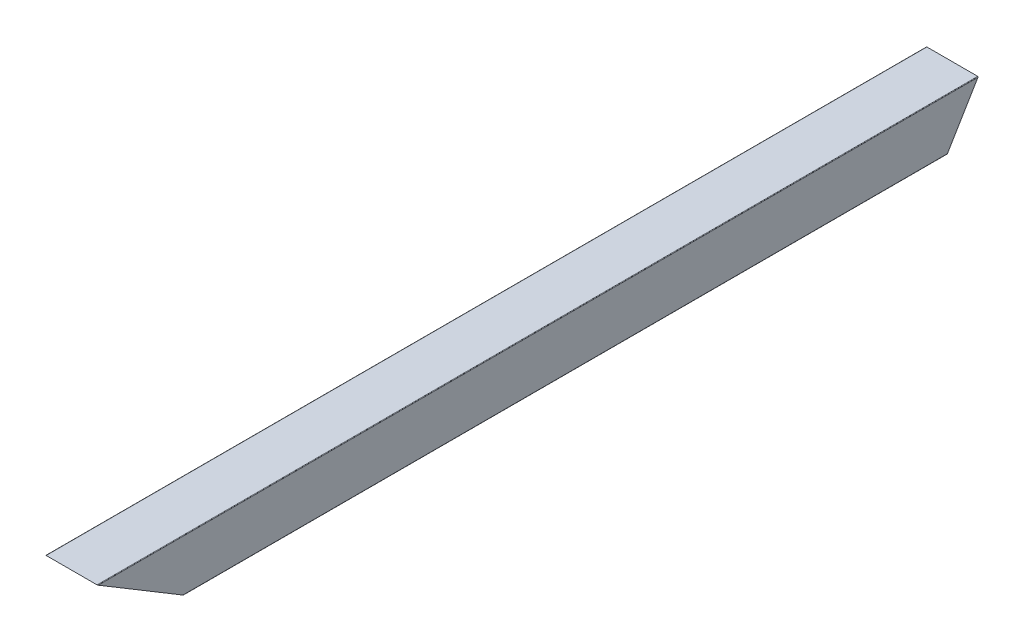
ISO-10303-21;
HEADER;
FILE_DESCRIPTION(('STEP AP214'),'2;1');
FILE_NAME('part.step','',(''),(''),'','','');
FILE_SCHEMA(('AUTOMOTIVE_DESIGN { 1 0 10303 214 1 1 1 1 }'));
ENDSEC;
DATA;
#1=APPLICATION_CONTEXT('core data for automotive mechanical design processes');
#2=APPLICATION_PROTOCOL_DEFINITION('international standard','automotive_design',2000,#1);
#3=PRODUCT_CONTEXT('',#1,'mechanical');
#4=PRODUCT('Part','Part','',(#3));
#5=PRODUCT_RELATED_PRODUCT_CATEGORY('part','',(#4));
#6=PRODUCT_DEFINITION_FORMATION('','',#4);
#7=PRODUCT_DEFINITION_CONTEXT('part definition',#1,'design');
#8=PRODUCT_DEFINITION('design','',#6,#7);
#9=PRODUCT_DEFINITION_SHAPE('','',#8);
#10=(LENGTH_UNIT() NAMED_UNIT(*) SI_UNIT(.MILLI.,.METRE.));
#11=(NAMED_UNIT(*) PLANE_ANGLE_UNIT() SI_UNIT($,.RADIAN.));
#12=(NAMED_UNIT(*) SI_UNIT($,.STERADIAN.) SOLID_ANGLE_UNIT());
#13=UNCERTAINTY_MEASURE_WITH_UNIT(LENGTH_MEASURE(1.E-05),#10,'distance_accuracy_value','');
#14=(GEOMETRIC_REPRESENTATION_CONTEXT(3) GLOBAL_UNCERTAINTY_ASSIGNED_CONTEXT((#13)) GLOBAL_UNIT_ASSIGNED_CONTEXT((#10,
#11,#12)) REPRESENTATION_CONTEXT('',''));
#15=CARTESIAN_POINT('',(0.,0.,0.));
#16=DIRECTION('',(0.,0.,1.));
#17=DIRECTION('',(1.,0.,0.));
#18=AXIS2_PLACEMENT_3D('',#15,#16,#17);
#19=CARTESIAN_POINT('',(0.254,25.4,1828.8));
#20=DIRECTION('',(0.,-1.,0.));
#21=DIRECTION('',(0.,0.,-1.));
#22=AXIS2_PLACEMENT_3D('',#19,#20,#21);
#23=PLANE('',#22);
#24=DIRECTION('',(0.,0.,-1.));
#25=VECTOR('',#24,1.);
#26=CARTESIAN_POINT('',(0.254,25.4,1828.8));
#27=LINE('',#26,#25);
#28=CARTESIAN_POINT('',(0.253999999999976,25.4,431.487140160496));
#29=VERTEX_POINT('',#28);
#30=CARTESIAN_POINT('',(0.254,25.4,0.));
#31=VERTEX_POINT('',#30);
#32=EDGE_CURVE('E195',#29,#31,#27,.T.);
#33=ORIENTED_EDGE('',*,*,#32,.F.);
#34=DIRECTION('',(1.,0.,0.));
#35=VECTOR('',#34,1.);
#36=CARTESIAN_POINT('',(-1155.7,25.4,431.487140160496));
#37=LINE('',#36,#35);
#38=CARTESIAN_POINT('',(25.146,25.4,431.487140160496));
#39=VERTEX_POINT('',#38);
#40=EDGE_CURVE('E167',#29,#39,#37,.T.);
#41=ORIENTED_EDGE('',*,*,#40,.T.);
#42=DIRECTION('',(0.,0.,-1.));
#43=VECTOR('',#42,1.);
#44=CARTESIAN_POINT('',(25.146,25.4,1828.8));
#45=LINE('',#44,#43);
#46=CARTESIAN_POINT('',(25.146,25.4,0.));
#47=VERTEX_POINT('',#46);
#48=EDGE_CURVE('E184',#39,#47,#45,.T.);
#49=ORIENTED_EDGE('',*,*,#48,.T.);
#50=DIRECTION('',(-1.,0.,0.));
#51=VECTOR('',#50,1.);
#52=CARTESIAN_POINT('',(0.254,25.4,0.));
#53=LINE('',#52,#51);
#54=EDGE_CURVE('E216',#47,#31,#53,.T.);
#55=ORIENTED_EDGE('',*,*,#54,.T.);
#56=EDGE_LOOP('',(#33,#41,#49,#55));
#57=FACE_BOUND('',#56,.T.);
#58=ADVANCED_FACE('F42',(#57),#23,.F.);
#59=CARTESIAN_POINT('',(0.254,0.254,1828.8));
#60=DIRECTION('',(0.,0.,-1.));
#61=DIRECTION('',(-1.,0.,0.));
#62=AXIS2_PLACEMENT_3D('',#59,#60,#61);
#63=CYLINDRICAL_SURFACE('',#62,0.254);
#64=CARTESIAN_POINT('',(0.254,0.254,389.63716829731));
#65=DIRECTION('',(0.,0.857167300702112,-0.515038074910055));
#66=DIRECTION('',(0.,-0.515038074910055,-0.857167300702112));
#67=AXIS2_PLACEMENT_3D('',#64,#65,#66);
#68=ELLIPSE('',#67,0.493167422708229,0.254);
#69=CARTESIAN_POINT('',(0.,0.253999999999865,389.63716829731));
#70=VERTEX_POINT('',#69);
#71=CARTESIAN_POINT('',(0.253999999999976,0.,389.214441308793));
#72=VERTEX_POINT('',#71);
#73=EDGE_CURVE('E302',#70,#72,#68,.F.);
#74=ORIENTED_EDGE('',*,*,#73,.F.);
#75=DIRECTION('',(0.,0.,-1.));
#76=VECTOR('',#75,1.);
#77=CARTESIAN_POINT('',(0.,0.254,1828.8));
#78=LINE('',#77,#76);
#79=CARTESIAN_POINT('',(0.,0.254000000000026,15.0876));
#80=VERTEX_POINT('',#79);
#81=EDGE_CURVE('E186',#70,#80,#78,.T.);
#82=ORIENTED_EDGE('',*,*,#81,.T.);
#83=CARTESIAN_POINT('',(0.254,0.254,15.0876));
#84=DIRECTION('',(0.,0.514495755427526,0.857492925712544));
#85=DIRECTION('',(0.,0.857492925712544,-0.514495755427526));
#86=AXIS2_PLACEMENT_3D('',#83,#84,#85);
#87=ELLIPSE('',#86,0.296212356258141,0.254);
#88=CARTESIAN_POINT('',(0.254,0.,15.24));
#89=VERTEX_POINT('',#88);
#90=EDGE_CURVE('E289',#89,#80,#87,.F.);
#91=ORIENTED_EDGE('',*,*,#90,.F.);
#92=DIRECTION('',(0.,0.,-1.));
#93=VECTOR('',#92,1.);
#94=CARTESIAN_POINT('',(0.254,0.,1828.8));
#95=LINE('',#94,#93);
#96=EDGE_CURVE('E214',#72,#89,#95,.T.);
#97=ORIENTED_EDGE('',*,*,#96,.F.);
#98=EDGE_LOOP('',(#74,#82,#91,#97));
#99=FACE_BOUND('',#98,.T.);
#100=ADVANCED_FACE('F332',(#99),#63,.T.);
#101=CARTESIAN_POINT('',(0.254,0.,1828.8));
#102=DIRECTION('',(0.,1.,0.));
#103=DIRECTION('',(1.,0.,0.));
#104=AXIS2_PLACEMENT_3D('',#101,#102,#103);
#105=PLANE('',#104);
#106=DIRECTION('',(0.,0.,-1.));
#107=VECTOR('',#106,1.);
#108=CARTESIAN_POINT('',(25.146,0.,1828.8));
#109=LINE('',#108,#107);
#110=CARTESIAN_POINT('',(25.1459999999999,0.,389.214441308793));
#111=VERTEX_POINT('',#110);
#112=CARTESIAN_POINT('',(25.146,0.,15.24));
#113=VERTEX_POINT('',#112);
#114=EDGE_CURVE('E182',#111,#113,#109,.T.);
#115=ORIENTED_EDGE('',*,*,#114,.F.);
#116=DIRECTION('',(1.,0.,0.));
#117=VECTOR('',#116,1.);
#118=CARTESIAN_POINT('',(-1155.7,0.,389.214441308793));
#119=LINE('',#118,#117);
#120=EDGE_CURVE('E163',#72,#111,#119,.T.);
#121=ORIENTED_EDGE('',*,*,#120,.F.);
#122=ORIENTED_EDGE('',*,*,#96,.T.);
#123=DIRECTION('',(1.,0.,0.));
#124=VECTOR('',#123,1.);
#125=CARTESIAN_POINT('',(0.,0.,15.24));
#126=LINE('',#125,#124);
#127=EDGE_CURVE('E292',#89,#113,#126,.T.);
#128=ORIENTED_EDGE('',*,*,#127,.T.);
#129=EDGE_LOOP('',(#115,#121,#122,#128));
#130=FACE_BOUND('',#129,.T.);
#131=ADVANCED_FACE('F337',(#130),#105,.F.);
#132=CARTESIAN_POINT('',(25.146,0.254,1828.8));
#133=DIRECTION('',(0.,0.,-1.));
#134=DIRECTION('',(-1.,0.,0.));
#135=AXIS2_PLACEMENT_3D('',#132,#133,#134);
#136=CYLINDRICAL_SURFACE('',#135,0.254);
#137=CARTESIAN_POINT('',(25.146,0.254,389.63716829731));
#138=DIRECTION('',(0.,0.857167300702112,-0.515038074910055));
#139=DIRECTION('',(0.,-0.515038074910055,-0.857167300702112));
#140=AXIS2_PLACEMENT_3D('',#137,#138,#139);
#141=ELLIPSE('',#140,0.493167422708229,0.254);
#142=CARTESIAN_POINT('',(25.4,0.253999999999796,389.63716829731));
#143=VERTEX_POINT('',#142);
#144=EDGE_CURVE('E157',#111,#143,#141,.F.);
#145=ORIENTED_EDGE('',*,*,#144,.F.);
#146=ORIENTED_EDGE('',*,*,#114,.T.);
#147=CARTESIAN_POINT('',(25.146,0.254,15.0876));
#148=DIRECTION('',(0.,0.514495755427526,0.857492925712544));
#149=DIRECTION('',(0.,0.857492925712544,-0.514495755427526));
#150=AXIS2_PLACEMENT_3D('',#147,#148,#149);
#151=ELLIPSE('',#150,0.296212356258141,0.254);
#152=CARTESIAN_POINT('',(25.4,0.254000000000026,15.0876));
#153=VERTEX_POINT('',#152);
#154=EDGE_CURVE('E181',#153,#113,#151,.F.);
#155=ORIENTED_EDGE('',*,*,#154,.F.);
#156=DIRECTION('',(0.,0.,-1.));
#157=VECTOR('',#156,1.);
#158=CARTESIAN_POINT('',(25.4,0.254,1828.8));
#159=LINE('',#158,#157);
#160=EDGE_CURVE('E174',#143,#153,#159,.T.);
#161=ORIENTED_EDGE('',*,*,#160,.F.);
#162=EDGE_LOOP('',(#145,#146,#155,#161));
#163=FACE_BOUND('',#162,.T.);
#164=ADVANCED_FACE('F179',(#163),#136,.T.);
#165=CARTESIAN_POINT('',(25.4,0.254,1828.8));
#166=DIRECTION('',(-1.,0.,0.));
#167=DIRECTION('',(0.,0.,1.));
#168=AXIS2_PLACEMENT_3D('',#165,#166,#167);
#169=PLANE('',#168);
#170=DIRECTION('',(0.,0.,-1.));
#171=VECTOR('',#170,1.);
#172=CARTESIAN_POINT('',(25.4,25.146,1828.8));
#173=LINE('',#172,#171);
#174=CARTESIAN_POINT('',(25.4,25.1459999999999,431.064413171979));
#175=VERTEX_POINT('',#174);
#176=CARTESIAN_POINT('',(25.4,25.1459999999999,0.152400000000086));
#177=VERTEX_POINT('',#176);
#178=EDGE_CURVE('E176',#175,#177,#173,.T.);
#179=ORIENTED_EDGE('',*,*,#178,.F.);
#180=DIRECTION('',(0.,0.515038074910055,0.857167300702112));
#181=VECTOR('',#180,1.);
#182=CARTESIAN_POINT('',(25.4,25.4,431.487140160496));
#183=LINE('',#182,#181);
#184=EDGE_CURVE('E160',#143,#175,#183,.T.);
#185=ORIENTED_EDGE('',*,*,#184,.F.);
#186=ORIENTED_EDGE('',*,*,#160,.T.);
#187=DIRECTION('',(0.,-0.857492925712544,0.514495755427526));
#188=VECTOR('',#187,1.);
#189=CARTESIAN_POINT('',(25.4,25.4,0.));
#190=LINE('',#189,#188);
#191=EDGE_CURVE('E296',#177,#153,#190,.T.);
#192=ORIENTED_EDGE('',*,*,#191,.F.);
#193=EDGE_LOOP('',(#179,#185,#186,#192));
#194=FACE_BOUND('',#193,.T.);
#195=ADVANCED_FACE('F172',(#194),#169,.F.);
#196=CARTESIAN_POINT('',(25.146,25.146,1828.8));
#197=DIRECTION('',(0.,0.,-1.));
#198=DIRECTION('',(-1.,0.,0.));
#199=AXIS2_PLACEMENT_3D('',#196,#197,#198);
#200=CYLINDRICAL_SURFACE('',#199,0.254);
#201=CARTESIAN_POINT('',(25.146,25.146,431.064413171979));
#202=DIRECTION('',(0.,0.857167300702112,-0.515038074910055));
#203=DIRECTION('',(0.,-0.515038074910055,-0.857167300702112));
#204=AXIS2_PLACEMENT_3D('',#201,#202,#203);
#205=ELLIPSE('',#204,0.493167422708229,0.254);
#206=EDGE_CURVE('E168',#175,#39,#205,.F.);
#207=ORIENTED_EDGE('',*,*,#206,.F.);
#208=ORIENTED_EDGE('',*,*,#178,.T.);
#209=CARTESIAN_POINT('',(25.146,25.146,0.152399999999941));
#210=DIRECTION('',(0.,0.514495755427526,0.857492925712544));
#211=DIRECTION('',(0.,0.857492925712544,-0.514495755427526));
#212=AXIS2_PLACEMENT_3D('',#209,#210,#211);
#213=ELLIPSE('',#212,0.296212356258141,0.254);
#214=EDGE_CURVE('E283',#47,#177,#213,.F.);
#215=ORIENTED_EDGE('',*,*,#214,.F.);
#216=ORIENTED_EDGE('',*,*,#48,.F.);
#217=EDGE_LOOP('',(#207,#208,#215,#216));
#218=FACE_BOUND('',#217,.T.);
#219=ADVANCED_FACE('F345',(#218),#200,.T.);
#220=CARTESIAN_POINT('',(0.254,25.146,1828.8));
#221=DIRECTION('',(0.,0.,-1.));
#222=DIRECTION('',(-1.,0.,0.));
#223=AXIS2_PLACEMENT_3D('',#220,#221,#222);
#224=CYLINDRICAL_SURFACE('',#223,0.254);
#225=CARTESIAN_POINT('',(0.254,25.146,431.064413171979));
#226=DIRECTION('',(0.,0.857167300702112,-0.515038074910055));
#227=DIRECTION('',(0.,-0.515038074910055,-0.857167300702112));
#228=AXIS2_PLACEMENT_3D('',#225,#226,#227);
#229=ELLIPSE('',#228,0.493167422708229,0.254);
#230=CARTESIAN_POINT('',(0.,25.1460000000001,431.064413171979));
#231=VERTEX_POINT('',#230);
#232=EDGE_CURVE('E304',#29,#231,#229,.F.);
#233=ORIENTED_EDGE('',*,*,#232,.F.);
#234=ORIENTED_EDGE('',*,*,#32,.T.);
#235=CARTESIAN_POINT('',(0.254,25.146,0.152399999999941));
#236=DIRECTION('',(0.,0.514495755427526,0.857492925712544));
#237=DIRECTION('',(0.,0.857492925712544,-0.514495755427526));
#238=AXIS2_PLACEMENT_3D('',#235,#236,#237);
#239=ELLIPSE('',#238,0.296212356258141,0.254);
#240=CARTESIAN_POINT('',(0.,25.146,0.152399999999985));
#241=VERTEX_POINT('',#240);
#242=EDGE_CURVE('E281',#241,#31,#239,.F.);
#243=ORIENTED_EDGE('',*,*,#242,.F.);
#244=DIRECTION('',(0.,0.,-1.));
#245=VECTOR('',#244,1.);
#246=CARTESIAN_POINT('',(0.,25.146,1828.8));
#247=LINE('',#246,#245);
#248=EDGE_CURVE('E194',#231,#241,#247,.T.);
#249=ORIENTED_EDGE('',*,*,#248,.F.);
#250=EDGE_LOOP('',(#233,#234,#243,#249));
#251=FACE_BOUND('',#250,.T.);
#252=ADVANCED_FACE('F341',(#251),#224,.T.);
#253=CARTESIAN_POINT('',(0.,0.254,1828.8));
#254=DIRECTION('',(1.,0.,0.));
#255=DIRECTION('',(0.,1.,0.));
#256=AXIS2_PLACEMENT_3D('',#253,#254,#255);
#257=PLANE('',#256);
#258=ORIENTED_EDGE('',*,*,#81,.F.);
#259=DIRECTION('',(0.,0.515038074910055,0.857167300702112));
#260=VECTOR('',#259,1.);
#261=CARTESIAN_POINT('',(0.,635.606678991964,1447.04159600007));
#262=LINE('',#261,#260);
#263=EDGE_CURVE('E274',#70,#231,#262,.T.);
#264=ORIENTED_EDGE('',*,*,#263,.T.);
#265=ORIENTED_EDGE('',*,*,#248,.T.);
#266=DIRECTION('',(0.,-0.857492925712544,0.514495755427526));
#267=VECTOR('',#266,1.);
#268=CARTESIAN_POINT('',(0.,25.4,0.));
#269=LINE('',#268,#267);
#270=EDGE_CURVE('E295',#241,#80,#269,.T.);
#271=ORIENTED_EDGE('',*,*,#270,.T.);
#272=EDGE_LOOP('',(#258,#264,#265,#271));
#273=FACE_BOUND('',#272,.T.);
#274=ADVANCED_FACE('F344',(#273),#257,.F.);
#275=CARTESIAN_POINT('',(0.,25.4,0.));
#276=DIRECTION('',(0.,0.514495755427526,0.857492925712544));
#277=DIRECTION('',(0.,-0.857492925712544,0.514495755427526));
#278=AXIS2_PLACEMENT_3D('',#275,#276,#277);
#279=PLANE('',#278);
#280=DIRECTION('',(0.,-0.857492925712544,0.514495755427526));
#281=VECTOR('',#280,1.);
#282=CARTESIAN_POINT('',(1.5875,-797.76544117647,493.899264705882));
#283=LINE('',#282,#281);
#284=CARTESIAN_POINT('',(1.5875,22.225,1.90500000000005));
#285=VERTEX_POINT('',#284);
#286=CARTESIAN_POINT('',(1.5875,3.175,13.3350000000001));
#287=VERTEX_POINT('',#286);
#288=EDGE_CURVE('E219',#285,#287,#283,.T.);
#289=ORIENTED_EDGE('',*,*,#288,.T.);
#290=CARTESIAN_POINT('',(3.175,3.175,13.3350000000001));
#291=DIRECTION('',(0.,0.514495755427526,0.857492925712544));
#292=DIRECTION('',(0.,0.857492925712544,-0.514495755427526));
#293=AXIS2_PLACEMENT_3D('',#290,#291,#292);
#294=ELLIPSE('',#293,1.85132722661338,1.5875);
#295=CARTESIAN_POINT('',(3.175,1.5875,14.2875000000002));
#296=VERTEX_POINT('',#295);
#297=EDGE_CURVE('E280',#296,#287,#294,.F.);
#298=ORIENTED_EDGE('',*,*,#297,.F.);
#299=DIRECTION('',(1.,0.,0.));
#300=VECTOR('',#299,1.);
#301=CARTESIAN_POINT('',(3.175,1.5875,14.2875000000002));
#302=LINE('',#301,#300);
#303=CARTESIAN_POINT('',(22.225,1.5875,14.2875000000002));
#304=VERTEX_POINT('',#303);
#305=EDGE_CURVE('E254',#296,#304,#302,.T.);
#306=ORIENTED_EDGE('',*,*,#305,.T.);
#307=CARTESIAN_POINT('',(22.225,3.175,13.3350000000001));
#308=DIRECTION('',(0.,0.514495755427526,0.857492925712544));
#309=DIRECTION('',(0.,0.857492925712544,-0.514495755427526));
#310=AXIS2_PLACEMENT_3D('',#307,#308,#309);
#311=ELLIPSE('',#310,1.85132722661338,1.5875);
#312=CARTESIAN_POINT('',(23.8125,3.175,13.3350000000001));
#313=VERTEX_POINT('',#312);
#314=EDGE_CURVE('E241',#313,#304,#311,.F.);
#315=ORIENTED_EDGE('',*,*,#314,.F.);
#316=DIRECTION('',(0.,0.857492925712544,-0.514495755427526));
#317=VECTOR('',#316,1.);
#318=CARTESIAN_POINT('',(23.8125,-797.76544117647,493.899264705882));
#319=LINE('',#318,#317);
#320=CARTESIAN_POINT('',(23.8125,22.2249999999999,1.90500000000055));
#321=VERTEX_POINT('',#320);
#322=EDGE_CURVE('E251',#313,#321,#319,.T.);
#323=ORIENTED_EDGE('',*,*,#322,.T.);
#324=CARTESIAN_POINT('',(22.225,22.225,1.90500000000005));
#325=DIRECTION('',(0.,0.514495755427526,0.857492925712544));
#326=DIRECTION('',(0.,0.857492925712544,-0.514495755427526));
#327=AXIS2_PLACEMENT_3D('',#324,#325,#326);
#328=ELLIPSE('',#327,1.85132722661338,1.5875);
#329=CARTESIAN_POINT('',(22.225,23.8125,0.952499999999912));
#330=VERTEX_POINT('',#329);
#331=EDGE_CURVE('E258',#330,#321,#328,.F.);
#332=ORIENTED_EDGE('',*,*,#331,.F.);
#333=DIRECTION('',(-1.,0.,0.));
#334=VECTOR('',#333,1.);
#335=CARTESIAN_POINT('',(3.175,23.8125,0.952499999999912));
#336=LINE('',#335,#334);
#337=CARTESIAN_POINT('',(3.175,23.8125,0.952499999999912));
#338=VERTEX_POINT('',#337);
#339=EDGE_CURVE('E230',#330,#338,#336,.T.);
#340=ORIENTED_EDGE('',*,*,#339,.T.);
#341=CARTESIAN_POINT('',(3.175,22.225,1.90500000000005));
#342=DIRECTION('',(0.,0.514495755427526,0.857492925712544));
#343=DIRECTION('',(0.,0.857492925712544,-0.514495755427526));
#344=AXIS2_PLACEMENT_3D('',#341,#342,#343);
#345=ELLIPSE('',#344,1.85132722661338,1.5875);
#346=EDGE_CURVE('E223',#285,#338,#345,.F.);
#347=ORIENTED_EDGE('',*,*,#346,.F.);
#348=EDGE_LOOP('',(#289,#298,#306,#315,#323,#332,#340,#347));
#349=FACE_BOUND('',#348,.T.);
#350=ORIENTED_EDGE('',*,*,#242,.T.);
#351=ORIENTED_EDGE('',*,*,#54,.F.);
#352=ORIENTED_EDGE('',*,*,#214,.T.);
#353=ORIENTED_EDGE('',*,*,#191,.T.);
#354=ORIENTED_EDGE('',*,*,#154,.T.);
#355=ORIENTED_EDGE('',*,*,#127,.F.);
#356=ORIENTED_EDGE('',*,*,#90,.T.);
#357=ORIENTED_EDGE('',*,*,#270,.F.);
#358=EDGE_LOOP('',(#350,#351,#352,#353,#354,#355,#356,#357));
#359=FACE_BOUND('',#358,.T.);
#360=ADVANCED_FACE('F248',(#349,#359),#279,.F.);
#361=CARTESIAN_POINT('',(1.5875,3.175,1828.8));
#362=DIRECTION('',(1.,0.,0.));
#363=DIRECTION('',(0.,1.,0.));
#364=AXIS2_PLACEMENT_3D('',#361,#362,#363);
#365=PLANE('',#364);
#366=DIRECTION('',(0.,0.515038074910055,0.857167300702112));
#367=VECTOR('',#366,1.);
#368=CARTESIAN_POINT('',(1.5875,636.381515774516,1448.33114095944));
#369=LINE('',#368,#367);
#370=CARTESIAN_POINT('',(1.5875,3.175,394.498528665256));
#371=VERTEX_POINT('',#370);
#372=CARTESIAN_POINT('',(1.5875,22.225,426.203052804033));
#373=VERTEX_POINT('',#372);
#374=EDGE_CURVE('E273',#371,#373,#369,.T.);
#375=ORIENTED_EDGE('',*,*,#374,.F.);
#376=DIRECTION('',(0.,0.,-1.));
#377=VECTOR('',#376,1.);
#378=CARTESIAN_POINT('',(1.5875,3.175,1828.8));
#379=LINE('',#378,#377);
#380=EDGE_CURVE('E46',#371,#287,#379,.T.);
#381=ORIENTED_EDGE('',*,*,#380,.T.);
#382=ORIENTED_EDGE('',*,*,#288,.F.);
#383=DIRECTION('',(0.,0.,-1.));
#384=VECTOR('',#383,1.);
#385=CARTESIAN_POINT('',(1.5875,22.225,1828.8));
#386=LINE('',#385,#384);
#387=EDGE_CURVE('E11',#373,#285,#386,.T.);
#388=ORIENTED_EDGE('',*,*,#387,.F.);
#389=EDGE_LOOP('',(#375,#381,#382,#388));
#390=FACE_BOUND('',#389,.T.);
#391=ADVANCED_FACE('F272',(#390),#365,.T.);
#392=CARTESIAN_POINT('',(3.175,22.225,1828.8));
#393=DIRECTION('',(0.,0.,-1.));
#394=DIRECTION('',(-1.,0.,0.));
#395=AXIS2_PLACEMENT_3D('',#392,#393,#394);
#396=CYLINDRICAL_SURFACE('',#395,1.5875);
#397=DIRECTION('',(0.,0.,-1.));
#398=VECTOR('',#397,1.);
#399=CARTESIAN_POINT('',(3.175,23.8125,1828.8));
#400=LINE('',#399,#398);
#401=CARTESIAN_POINT('',(3.175,23.8125,428.845096482265));
#402=VERTEX_POINT('',#401);
#403=EDGE_CURVE('E51',#402,#338,#400,.T.);
#404=ORIENTED_EDGE('',*,*,#403,.F.);
#405=CARTESIAN_POINT('',(3.175,22.225,426.203052804033));
#406=DIRECTION('',(0.,0.857167300702112,-0.515038074910055));
#407=DIRECTION('',(0.,-0.515038074910055,-0.857167300702112));
#408=AXIS2_PLACEMENT_3D('',#405,#406,#407);
#409=ELLIPSE('',#408,3.08229639192643,1.5875);
#410=EDGE_CURVE('E271',#402,#373,#409,.F.);
#411=ORIENTED_EDGE('',*,*,#410,.T.);
#412=ORIENTED_EDGE('',*,*,#387,.T.);
#413=ORIENTED_EDGE('',*,*,#346,.T.);
#414=EDGE_LOOP('',(#404,#411,#412,#413));
#415=FACE_BOUND('',#414,.T.);
#416=ADVANCED_FACE('F268',(#415),#396,.F.);
#417=CARTESIAN_POINT('',(3.175,23.8125,1828.8));
#418=DIRECTION('',(0.,-1.,0.));
#419=DIRECTION('',(0.,0.,-1.));
#420=AXIS2_PLACEMENT_3D('',#417,#418,#419);
#421=PLANE('',#420);
#422=DIRECTION('',(1.,0.,0.));
#423=VECTOR('',#422,1.);
#424=CARTESIAN_POINT('',(3.175,23.8125,428.845096482265));
#425=LINE('',#424,#423);
#426=CARTESIAN_POINT('',(22.225,23.8125,428.845096482265));
#427=VERTEX_POINT('',#426);
#428=EDGE_CURVE('E308',#402,#427,#425,.T.);
#429=ORIENTED_EDGE('',*,*,#428,.F.);
#430=ORIENTED_EDGE('',*,*,#403,.T.);
#431=ORIENTED_EDGE('',*,*,#339,.F.);
#432=DIRECTION('',(0.,0.,-1.));
#433=VECTOR('',#432,1.);
#434=CARTESIAN_POINT('',(22.225,23.8125,1828.8));
#435=LINE('',#434,#433);
#436=EDGE_CURVE('E192',#427,#330,#435,.T.);
#437=ORIENTED_EDGE('',*,*,#436,.F.);
#438=EDGE_LOOP('',(#429,#430,#431,#437));
#439=FACE_BOUND('',#438,.T.);
#440=ADVANCED_FACE('F321',(#439),#421,.T.);
#441=CARTESIAN_POINT('',(22.225,22.225,1828.8));
#442=DIRECTION('',(0.,0.,-1.));
#443=DIRECTION('',(-1.,0.,0.));
#444=AXIS2_PLACEMENT_3D('',#441,#442,#443);
#445=CYLINDRICAL_SURFACE('',#444,1.5875);
#446=DIRECTION('',(0.,0.,-1.));
#447=VECTOR('',#446,1.);
#448=CARTESIAN_POINT('',(23.8125,22.225,1828.8));
#449=LINE('',#448,#447);
#450=CARTESIAN_POINT('',(23.8125,22.2250000000001,426.203052804033));
#451=VERTEX_POINT('',#450);
#452=EDGE_CURVE('E191',#451,#321,#449,.T.);
#453=ORIENTED_EDGE('',*,*,#452,.F.);
#454=CARTESIAN_POINT('',(22.225,22.225,426.203052804033));
#455=DIRECTION('',(0.,0.857167300702112,-0.515038074910055));
#456=DIRECTION('',(0.,-0.515038074910055,-0.857167300702112));
#457=AXIS2_PLACEMENT_3D('',#454,#455,#456);
#458=ELLIPSE('',#457,3.08229639192643,1.5875);
#459=EDGE_CURVE('E310',#451,#427,#458,.F.);
#460=ORIENTED_EDGE('',*,*,#459,.T.);
#461=ORIENTED_EDGE('',*,*,#436,.T.);
#462=ORIENTED_EDGE('',*,*,#331,.T.);
#463=EDGE_LOOP('',(#453,#460,#461,#462));
#464=FACE_BOUND('',#463,.T.);
#465=ADVANCED_FACE('F319',(#464),#445,.F.);
#466=CARTESIAN_POINT('',(23.8125,3.175,1828.8));
#467=DIRECTION('',(-1.,0.,0.));
#468=DIRECTION('',(0.,0.,1.));
#469=AXIS2_PLACEMENT_3D('',#466,#467,#468);
#470=PLANE('',#469);
#471=DIRECTION('',(0.,-0.515038074910055,-0.857167300702112));
#472=VECTOR('',#471,1.);
#473=CARTESIAN_POINT('',(23.8125,636.381515774516,1448.33114095944));
#474=LINE('',#473,#472);
#475=CARTESIAN_POINT('',(23.8125,3.175,394.498528665256));
#476=VERTEX_POINT('',#475);
#477=EDGE_CURVE('E313',#451,#476,#474,.T.);
#478=ORIENTED_EDGE('',*,*,#477,.F.);
#479=ORIENTED_EDGE('',*,*,#452,.T.);
#480=ORIENTED_EDGE('',*,*,#322,.F.);
#481=DIRECTION('',(0.,0.,-1.));
#482=VECTOR('',#481,1.);
#483=CARTESIAN_POINT('',(23.8125,3.175,1828.8));
#484=LINE('',#483,#482);
#485=EDGE_CURVE('E193',#476,#313,#484,.T.);
#486=ORIENTED_EDGE('',*,*,#485,.F.);
#487=EDGE_LOOP('',(#478,#479,#480,#486));
#488=FACE_BOUND('',#487,.T.);
#489=ADVANCED_FACE('F256',(#488),#470,.T.);
#490=CARTESIAN_POINT('',(22.225,3.175,1828.8));
#491=DIRECTION('',(0.,0.,-1.));
#492=DIRECTION('',(-1.,0.,0.));
#493=AXIS2_PLACEMENT_3D('',#490,#491,#492);
#494=CYLINDRICAL_SURFACE('',#493,1.5875);
#495=DIRECTION('',(0.,0.,-1.));
#496=VECTOR('',#495,1.);
#497=CARTESIAN_POINT('',(22.225,1.5875,1828.8));
#498=LINE('',#497,#496);
#499=CARTESIAN_POINT('',(22.225,1.5875,391.856484987025));
#500=VERTEX_POINT('',#499);
#501=EDGE_CURVE('E210',#500,#304,#498,.T.);
#502=ORIENTED_EDGE('',*,*,#501,.F.);
#503=CARTESIAN_POINT('',(22.225,3.175,394.498528665256));
#504=DIRECTION('',(0.,0.857167300702112,-0.515038074910055));
#505=DIRECTION('',(0.,-0.515038074910055,-0.857167300702112));
#506=AXIS2_PLACEMENT_3D('',#503,#504,#505);
#507=ELLIPSE('',#506,3.08229639192643,1.5875);
#508=EDGE_CURVE('E242',#500,#476,#507,.F.);
#509=ORIENTED_EDGE('',*,*,#508,.T.);
#510=ORIENTED_EDGE('',*,*,#485,.T.);
#511=ORIENTED_EDGE('',*,*,#314,.T.);
#512=EDGE_LOOP('',(#502,#509,#510,#511));
#513=FACE_BOUND('',#512,.T.);
#514=ADVANCED_FACE('F240',(#513),#494,.F.);
#515=CARTESIAN_POINT('',(3.175,1.5875,1828.8));
#516=DIRECTION('',(0.,1.,0.));
#517=DIRECTION('',(1.,0.,0.));
#518=AXIS2_PLACEMENT_3D('',#515,#516,#517);
#519=PLANE('',#518);
#520=DIRECTION('',(-1.,0.,0.));
#521=VECTOR('',#520,1.);
#522=CARTESIAN_POINT('',(3.175,1.5875,391.856484987025));
#523=LINE('',#522,#521);
#524=CARTESIAN_POINT('',(3.175,1.5875,391.856484987025));
#525=VERTEX_POINT('',#524);
#526=EDGE_CURVE('E59',#500,#525,#523,.T.);
#527=ORIENTED_EDGE('',*,*,#526,.F.);
#528=ORIENTED_EDGE('',*,*,#501,.T.);
#529=ORIENTED_EDGE('',*,*,#305,.F.);
#530=DIRECTION('',(0.,0.,-1.));
#531=VECTOR('',#530,1.);
#532=CARTESIAN_POINT('',(3.175,1.5875,1828.8));
#533=LINE('',#532,#531);
#534=EDGE_CURVE('E201',#525,#296,#533,.T.);
#535=ORIENTED_EDGE('',*,*,#534,.F.);
#536=EDGE_LOOP('',(#527,#528,#529,#535));
#537=FACE_BOUND('',#536,.T.);
#538=ADVANCED_FACE('F44',(#537),#519,.T.);
#539=CARTESIAN_POINT('',(3.175,3.175,1828.8));
#540=DIRECTION('',(0.,0.,-1.));
#541=DIRECTION('',(-1.,0.,0.));
#542=AXIS2_PLACEMENT_3D('',#539,#540,#541);
#543=CYLINDRICAL_SURFACE('',#542,1.5875);
#544=ORIENTED_EDGE('',*,*,#380,.F.);
#545=CARTESIAN_POINT('',(3.175,3.175,394.498528665256));
#546=DIRECTION('',(0.,0.857167300702112,-0.515038074910055));
#547=DIRECTION('',(0.,-0.515038074910055,-0.857167300702112));
#548=AXIS2_PLACEMENT_3D('',#545,#546,#547);
#549=ELLIPSE('',#548,3.08229639192643,1.5875);
#550=EDGE_CURVE('E278',#371,#525,#549,.F.);
#551=ORIENTED_EDGE('',*,*,#550,.T.);
#552=ORIENTED_EDGE('',*,*,#534,.T.);
#553=ORIENTED_EDGE('',*,*,#297,.T.);
#554=EDGE_LOOP('',(#544,#551,#552,#553));
#555=FACE_BOUND('',#554,.T.);
#556=ADVANCED_FACE('F277',(#555),#543,.F.);
#557=CARTESIAN_POINT('',(-1155.7,25.4,431.487140160496));
#558=DIRECTION('',(0.,0.857167300702112,-0.515038074910055));
#559=DIRECTION('',(0.,0.515038074910055,0.857167300702112));
#560=AXIS2_PLACEMENT_3D('',#557,#558,#559);
#561=PLANE('',#560);
#562=ORIENTED_EDGE('',*,*,#144,.T.);
#563=ORIENTED_EDGE('',*,*,#184,.T.);
#564=ORIENTED_EDGE('',*,*,#206,.T.);
#565=ORIENTED_EDGE('',*,*,#40,.F.);
#566=ORIENTED_EDGE('',*,*,#232,.T.);
#567=ORIENTED_EDGE('',*,*,#263,.F.);
#568=ORIENTED_EDGE('',*,*,#73,.T.);
#569=ORIENTED_EDGE('',*,*,#120,.T.);
#570=EDGE_LOOP('',(#562,#563,#564,#565,#566,#567,#568,#569));
#571=FACE_BOUND('',#570,.T.);
#572=ORIENTED_EDGE('',*,*,#374,.T.);
#573=ORIENTED_EDGE('',*,*,#410,.F.);
#574=ORIENTED_EDGE('',*,*,#428,.T.);
#575=ORIENTED_EDGE('',*,*,#459,.F.);
#576=ORIENTED_EDGE('',*,*,#477,.T.);
#577=ORIENTED_EDGE('',*,*,#508,.F.);
#578=ORIENTED_EDGE('',*,*,#526,.T.);
#579=ORIENTED_EDGE('',*,*,#550,.F.);
#580=EDGE_LOOP('',(#572,#573,#574,#575,#576,#577,#578,#579));
#581=FACE_BOUND('',#580,.T.);
#582=ADVANCED_FACE('F159',(#571,#581),#561,.F.);
#583=CLOSED_SHELL('',(#58,#100,#131,#164,#195,#219,#252,#274,#360,#391,#416,#440,#465,#489,#514,
#538,#556,#582));
#584=MANIFOLD_SOLID_BREP('B2',#583);
#585=ADVANCED_BREP_SHAPE_REPRESENTATION('',(#18,#584),#14);
#586=SHAPE_DEFINITION_REPRESENTATION(#9,#585);
ENDSEC;
END-ISO-10303-21;
